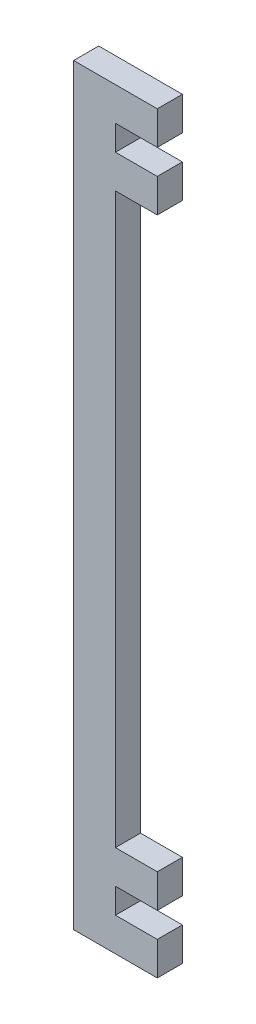
ISO-10303-21;
HEADER;
FILE_DESCRIPTION(('STEP AP214'),'2;1');
FILE_NAME('part.step','',(''),(''),'','','');
FILE_SCHEMA(('AUTOMOTIVE_DESIGN { 1 0 10303 214 1 1 1 1 }'));
ENDSEC;
DATA;
#1=APPLICATION_CONTEXT('core data for automotive mechanical design processes');
#2=APPLICATION_PROTOCOL_DEFINITION('international standard','automotive_design',2000,#1);
#3=PRODUCT_CONTEXT('',#1,'mechanical');
#4=PRODUCT('Part','Part','',(#3));
#5=PRODUCT_RELATED_PRODUCT_CATEGORY('part','',(#4));
#6=PRODUCT_DEFINITION_FORMATION('','',#4);
#7=PRODUCT_DEFINITION_CONTEXT('part definition',#1,'design');
#8=PRODUCT_DEFINITION('design','',#6,#7);
#9=PRODUCT_DEFINITION_SHAPE('','',#8);
#10=(LENGTH_UNIT() NAMED_UNIT(*) SI_UNIT(.MILLI.,.METRE.));
#11=(NAMED_UNIT(*) PLANE_ANGLE_UNIT() SI_UNIT($,.RADIAN.));
#12=(NAMED_UNIT(*) SI_UNIT($,.STERADIAN.) SOLID_ANGLE_UNIT());
#13=UNCERTAINTY_MEASURE_WITH_UNIT(LENGTH_MEASURE(1.E-05),#10,'distance_accuracy_value','');
#14=(GEOMETRIC_REPRESENTATION_CONTEXT(3) GLOBAL_UNCERTAINTY_ASSIGNED_CONTEXT((#13)) GLOBAL_UNIT_ASSIGNED_CONTEXT((#10,
#11,#12)) REPRESENTATION_CONTEXT('',''));
#15=CARTESIAN_POINT('',(0.,0.,0.));
#16=DIRECTION('',(0.,0.,1.));
#17=DIRECTION('',(1.,0.,0.));
#18=AXIS2_PLACEMENT_3D('',#15,#16,#17);
#19=CARTESIAN_POINT('',(0.,0.,3.));
#20=DIRECTION('',(1.,0.,0.));
#21=DIRECTION('',(0.,0.,-1.));
#22=AXIS2_PLACEMENT_3D('',#19,#20,#21);
#23=PLANE('',#22);
#24=DIRECTION('',(0.,-1.,0.));
#25=VECTOR('',#24,1.);
#26=CARTESIAN_POINT('',(0.,0.,0.));
#27=LINE('',#26,#25);
#28=CARTESIAN_POINT('',(0.,90.,0.));
#29=VERTEX_POINT('',#28);
#30=CARTESIAN_POINT('',(0.,0.,0.));
#31=VERTEX_POINT('',#30);
#32=EDGE_CURVE('E300',#29,#31,#27,.T.);
#33=ORIENTED_EDGE('',*,*,#32,.T.);
#34=DIRECTION('',(0.,0.,-1.));
#35=VECTOR('',#34,1.);
#36=CARTESIAN_POINT('',(0.,0.,3.));
#37=LINE('',#36,#35);
#38=CARTESIAN_POINT('',(0.,0.,3.));
#39=VERTEX_POINT('',#38);
#40=EDGE_CURVE('E12',#39,#31,#37,.T.);
#41=ORIENTED_EDGE('',*,*,#40,.F.);
#42=DIRECTION('',(0.,-1.,0.));
#43=VECTOR('',#42,1.);
#44=CARTESIAN_POINT('',(0.,0.,3.));
#45=LINE('',#44,#43);
#46=CARTESIAN_POINT('',(0.,90.,3.));
#47=VERTEX_POINT('',#46);
#48=EDGE_CURVE('E241',#47,#39,#45,.T.);
#49=ORIENTED_EDGE('',*,*,#48,.F.);
#50=DIRECTION('',(0.,0.,-1.));
#51=VECTOR('',#50,1.);
#52=CARTESIAN_POINT('',(0.,90.,3.));
#53=LINE('',#52,#51);
#54=EDGE_CURVE('E178',#47,#29,#53,.T.);
#55=ORIENTED_EDGE('',*,*,#54,.T.);
#56=EDGE_LOOP('',(#33,#41,#49,#55));
#57=FACE_BOUND('',#56,.T.);
#58=ADVANCED_FACE('F35',(#57),#23,.F.);
#59=CARTESIAN_POINT('',(0.,0.,3.));
#60=DIRECTION('',(0.,1.,0.));
#61=DIRECTION('',(0.,0.,1.));
#62=AXIS2_PLACEMENT_3D('',#59,#60,#61);
#63=PLANE('',#62);
#64=DIRECTION('',(1.,0.,0.));
#65=VECTOR('',#64,1.);
#66=CARTESIAN_POINT('',(0.,0.,0.));
#67=LINE('',#66,#65);
#68=CARTESIAN_POINT('',(10.,0.,0.));
#69=VERTEX_POINT('',#68);
#70=EDGE_CURVE('E294',#31,#69,#67,.T.);
#71=ORIENTED_EDGE('',*,*,#70,.T.);
#72=DIRECTION('',(0.,0.,-1.));
#73=VECTOR('',#72,1.);
#74=CARTESIAN_POINT('',(10.,0.,3.));
#75=LINE('',#74,#73);
#76=CARTESIAN_POINT('',(10.,0.,3.));
#77=VERTEX_POINT('',#76);
#78=EDGE_CURVE('E43',#77,#69,#75,.T.);
#79=ORIENTED_EDGE('',*,*,#78,.F.);
#80=DIRECTION('',(1.,0.,0.));
#81=VECTOR('',#80,1.);
#82=CARTESIAN_POINT('',(0.,0.,3.));
#83=LINE('',#82,#81);
#84=EDGE_CURVE('E118',#39,#77,#83,.T.);
#85=ORIENTED_EDGE('',*,*,#84,.F.);
#86=ORIENTED_EDGE('',*,*,#40,.T.);
#87=EDGE_LOOP('',(#71,#79,#85,#86));
#88=FACE_BOUND('',#87,.T.);
#89=ADVANCED_FACE('F337',(#88),#63,.F.);
#90=CARTESIAN_POINT('',(10.,0.,3.));
#91=DIRECTION('',(-1.,0.,0.));
#92=DIRECTION('',(0.,0.,1.));
#93=AXIS2_PLACEMENT_3D('',#90,#91,#92);
#94=PLANE('',#93);
#95=DIRECTION('',(0.,1.,0.));
#96=VECTOR('',#95,1.);
#97=CARTESIAN_POINT('',(10.,0.,0.));
#98=LINE('',#97,#96);
#99=CARTESIAN_POINT('',(10.,4.,0.));
#100=VERTEX_POINT('',#99);
#101=EDGE_CURVE('E289',#69,#100,#98,.T.);
#102=ORIENTED_EDGE('',*,*,#101,.T.);
#103=DIRECTION('',(0.,0.,-1.));
#104=VECTOR('',#103,1.);
#105=CARTESIAN_POINT('',(10.,4.,3.));
#106=LINE('',#105,#104);
#107=CARTESIAN_POINT('',(10.,4.,3.));
#108=VERTEX_POINT('',#107);
#109=EDGE_CURVE('E281',#108,#100,#106,.T.);
#110=ORIENTED_EDGE('',*,*,#109,.F.);
#111=DIRECTION('',(0.,1.,0.));
#112=VECTOR('',#111,1.);
#113=CARTESIAN_POINT('',(10.,0.,3.));
#114=LINE('',#113,#112);
#115=EDGE_CURVE('E233',#77,#108,#114,.T.);
#116=ORIENTED_EDGE('',*,*,#115,.F.);
#117=ORIENTED_EDGE('',*,*,#78,.T.);
#118=EDGE_LOOP('',(#102,#110,#116,#117));
#119=FACE_BOUND('',#118,.T.);
#120=ADVANCED_FACE('F287',(#119),#94,.F.);
#121=CARTESIAN_POINT('',(10.,4.,3.));
#122=DIRECTION('',(0.,-1.,0.));
#123=DIRECTION('',(1.,0.,0.));
#124=AXIS2_PLACEMENT_3D('',#121,#122,#123);
#125=PLANE('',#124);
#126=DIRECTION('',(-1.,0.,0.));
#127=VECTOR('',#126,1.);
#128=CARTESIAN_POINT('',(10.,4.,0.));
#129=LINE('',#128,#127);
#130=CARTESIAN_POINT('',(5.,4.,0.));
#131=VERTEX_POINT('',#130);
#132=EDGE_CURVE('E296',#100,#131,#129,.T.);
#133=ORIENTED_EDGE('',*,*,#132,.T.);
#134=DIRECTION('',(0.,0.,-1.));
#135=VECTOR('',#134,1.);
#136=CARTESIAN_POINT('',(5.,4.,3.));
#137=LINE('',#136,#135);
#138=CARTESIAN_POINT('',(5.,4.,3.));
#139=VERTEX_POINT('',#138);
#140=EDGE_CURVE('E278',#139,#131,#137,.T.);
#141=ORIENTED_EDGE('',*,*,#140,.F.);
#142=DIRECTION('',(-1.,0.,0.));
#143=VECTOR('',#142,1.);
#144=CARTESIAN_POINT('',(10.,4.,3.));
#145=LINE('',#144,#143);
#146=EDGE_CURVE('E229',#108,#139,#145,.T.);
#147=ORIENTED_EDGE('',*,*,#146,.F.);
#148=ORIENTED_EDGE('',*,*,#109,.T.);
#149=EDGE_LOOP('',(#133,#141,#147,#148));
#150=FACE_BOUND('',#149,.T.);
#151=ADVANCED_FACE('F344',(#150),#125,.F.);
#152=CARTESIAN_POINT('',(5.,4.,3.));
#153=DIRECTION('',(-1.,0.,0.));
#154=DIRECTION('',(0.,0.,1.));
#155=AXIS2_PLACEMENT_3D('',#152,#153,#154);
#156=PLANE('',#155);
#157=DIRECTION('',(0.,1.,0.));
#158=VECTOR('',#157,1.);
#159=CARTESIAN_POINT('',(5.,4.,0.));
#160=LINE('',#159,#158);
#161=CARTESIAN_POINT('',(5.,7.,0.));
#162=VERTEX_POINT('',#161);
#163=EDGE_CURVE('E298',#131,#162,#160,.T.);
#164=ORIENTED_EDGE('',*,*,#163,.T.);
#165=DIRECTION('',(0.,0.,-1.));
#166=VECTOR('',#165,1.);
#167=CARTESIAN_POINT('',(5.,7.,3.));
#168=LINE('',#167,#166);
#169=CARTESIAN_POINT('',(5.,7.,3.));
#170=VERTEX_POINT('',#169);
#171=EDGE_CURVE('E275',#170,#162,#168,.T.);
#172=ORIENTED_EDGE('',*,*,#171,.F.);
#173=DIRECTION('',(0.,1.,0.));
#174=VECTOR('',#173,1.);
#175=CARTESIAN_POINT('',(5.,4.,3.));
#176=LINE('',#175,#174);
#177=EDGE_CURVE('E226',#139,#170,#176,.T.);
#178=ORIENTED_EDGE('',*,*,#177,.F.);
#179=ORIENTED_EDGE('',*,*,#140,.T.);
#180=EDGE_LOOP('',(#164,#172,#178,#179));
#181=FACE_BOUND('',#180,.T.);
#182=ADVANCED_FACE('F349',(#181),#156,.F.);
#183=CARTESIAN_POINT('',(5.,7.,3.));
#184=DIRECTION('',(0.,1.,0.));
#185=DIRECTION('',(0.,0.,1.));
#186=AXIS2_PLACEMENT_3D('',#183,#184,#185);
#187=PLANE('',#186);
#188=DIRECTION('',(1.,0.,0.));
#189=VECTOR('',#188,1.);
#190=CARTESIAN_POINT('',(5.,7.,0.));
#191=LINE('',#190,#189);
#192=CARTESIAN_POINT('',(10.,7.,0.));
#193=VERTEX_POINT('',#192);
#194=EDGE_CURVE('E304',#162,#193,#191,.T.);
#195=ORIENTED_EDGE('',*,*,#194,.T.);
#196=DIRECTION('',(0.,0.,-1.));
#197=VECTOR('',#196,1.);
#198=CARTESIAN_POINT('',(10.,7.,3.));
#199=LINE('',#198,#197);
#200=CARTESIAN_POINT('',(10.,7.,3.));
#201=VERTEX_POINT('',#200);
#202=EDGE_CURVE('E272',#201,#193,#199,.T.);
#203=ORIENTED_EDGE('',*,*,#202,.F.);
#204=DIRECTION('',(1.,0.,0.));
#205=VECTOR('',#204,1.);
#206=CARTESIAN_POINT('',(5.,7.,3.));
#207=LINE('',#206,#205);
#208=EDGE_CURVE('E218',#170,#201,#207,.T.);
#209=ORIENTED_EDGE('',*,*,#208,.F.);
#210=ORIENTED_EDGE('',*,*,#171,.T.);
#211=EDGE_LOOP('',(#195,#203,#209,#210));
#212=FACE_BOUND('',#211,.T.);
#213=ADVANCED_FACE('F353',(#212),#187,.F.);
#214=CARTESIAN_POINT('',(10.,7.,3.));
#215=DIRECTION('',(-1.,0.,0.));
#216=DIRECTION('',(0.,0.,1.));
#217=AXIS2_PLACEMENT_3D('',#214,#215,#216);
#218=PLANE('',#217);
#219=DIRECTION('',(0.,1.,0.));
#220=VECTOR('',#219,1.);
#221=CARTESIAN_POINT('',(10.,7.,0.));
#222=LINE('',#221,#220);
#223=CARTESIAN_POINT('',(10.,11.,0.));
#224=VERTEX_POINT('',#223);
#225=EDGE_CURVE('E306',#193,#224,#222,.T.);
#226=ORIENTED_EDGE('',*,*,#225,.T.);
#227=DIRECTION('',(0.,0.,-1.));
#228=VECTOR('',#227,1.);
#229=CARTESIAN_POINT('',(10.,11.,3.));
#230=LINE('',#229,#228);
#231=CARTESIAN_POINT('',(10.,11.,3.));
#232=VERTEX_POINT('',#231);
#233=EDGE_CURVE('E269',#232,#224,#230,.T.);
#234=ORIENTED_EDGE('',*,*,#233,.F.);
#235=DIRECTION('',(0.,1.,0.));
#236=VECTOR('',#235,1.);
#237=CARTESIAN_POINT('',(10.,7.,3.));
#238=LINE('',#237,#236);
#239=EDGE_CURVE('E214',#201,#232,#238,.T.);
#240=ORIENTED_EDGE('',*,*,#239,.F.);
#241=ORIENTED_EDGE('',*,*,#202,.T.);
#242=EDGE_LOOP('',(#226,#234,#240,#241));
#243=FACE_BOUND('',#242,.T.);
#244=ADVANCED_FACE('F357',(#243),#218,.F.);
#245=CARTESIAN_POINT('',(10.,11.,3.));
#246=DIRECTION('',(0.,-1.,0.));
#247=DIRECTION('',(0.,0.,-1.));
#248=AXIS2_PLACEMENT_3D('',#245,#246,#247);
#249=PLANE('',#248);
#250=DIRECTION('',(-1.,0.,0.));
#251=VECTOR('',#250,1.);
#252=CARTESIAN_POINT('',(10.,11.,0.));
#253=LINE('',#252,#251);
#254=CARTESIAN_POINT('',(5.,11.,0.));
#255=VERTEX_POINT('',#254);
#256=EDGE_CURVE('E308',#224,#255,#253,.T.);
#257=ORIENTED_EDGE('',*,*,#256,.T.);
#258=DIRECTION('',(0.,0.,-1.));
#259=VECTOR('',#258,1.);
#260=CARTESIAN_POINT('',(5.,11.,3.));
#261=LINE('',#260,#259);
#262=CARTESIAN_POINT('',(5.,11.,3.));
#263=VERTEX_POINT('',#262);
#264=EDGE_CURVE('E266',#263,#255,#261,.T.);
#265=ORIENTED_EDGE('',*,*,#264,.F.);
#266=DIRECTION('',(-1.,0.,0.));
#267=VECTOR('',#266,1.);
#268=CARTESIAN_POINT('',(10.,11.,3.));
#269=LINE('',#268,#267);
#270=EDGE_CURVE('E210',#232,#263,#269,.T.);
#271=ORIENTED_EDGE('',*,*,#270,.F.);
#272=ORIENTED_EDGE('',*,*,#233,.T.);
#273=EDGE_LOOP('',(#257,#265,#271,#272));
#274=FACE_BOUND('',#273,.T.);
#275=ADVANCED_FACE('F361',(#274),#249,.F.);
#276=CARTESIAN_POINT('',(5.,11.,3.));
#277=DIRECTION('',(-1.,0.,0.));
#278=DIRECTION('',(0.,0.,1.));
#279=AXIS2_PLACEMENT_3D('',#276,#277,#278);
#280=PLANE('',#279);
#281=DIRECTION('',(0.,1.,0.));
#282=VECTOR('',#281,1.);
#283=CARTESIAN_POINT('',(5.,11.,0.));
#284=LINE('',#283,#282);
#285=CARTESIAN_POINT('',(5.,79.,0.));
#286=VERTEX_POINT('',#285);
#287=EDGE_CURVE('E310',#255,#286,#284,.T.);
#288=ORIENTED_EDGE('',*,*,#287,.T.);
#289=DIRECTION('',(0.,0.,-1.));
#290=VECTOR('',#289,1.);
#291=CARTESIAN_POINT('',(5.,79.,3.));
#292=LINE('',#291,#290);
#293=CARTESIAN_POINT('',(5.,79.,3.));
#294=VERTEX_POINT('',#293);
#295=EDGE_CURVE('E263',#294,#286,#292,.T.);
#296=ORIENTED_EDGE('',*,*,#295,.F.);
#297=DIRECTION('',(0.,1.,0.));
#298=VECTOR('',#297,1.);
#299=CARTESIAN_POINT('',(5.,11.,3.));
#300=LINE('',#299,#298);
#301=EDGE_CURVE('E207',#263,#294,#300,.T.);
#302=ORIENTED_EDGE('',*,*,#301,.F.);
#303=ORIENTED_EDGE('',*,*,#264,.T.);
#304=EDGE_LOOP('',(#288,#296,#302,#303));
#305=FACE_BOUND('',#304,.T.);
#306=ADVANCED_FACE('F365',(#305),#280,.F.);
#307=CARTESIAN_POINT('',(10.,79.,3.));
#308=DIRECTION('',(0.,1.,0.));
#309=DIRECTION('',(0.,0.,1.));
#310=AXIS2_PLACEMENT_3D('',#307,#308,#309);
#311=PLANE('',#310);
#312=DIRECTION('',(1.,0.,0.));
#313=VECTOR('',#312,1.);
#314=CARTESIAN_POINT('',(10.,79.,0.));
#315=LINE('',#314,#313);
#316=CARTESIAN_POINT('',(10.,79.,0.));
#317=VERTEX_POINT('',#316);
#318=EDGE_CURVE('E312',#286,#317,#315,.T.);
#319=ORIENTED_EDGE('',*,*,#318,.T.);
#320=DIRECTION('',(0.,0.,-1.));
#321=VECTOR('',#320,1.);
#322=CARTESIAN_POINT('',(10.,79.,3.));
#323=LINE('',#322,#321);
#324=CARTESIAN_POINT('',(10.,79.,3.));
#325=VERTEX_POINT('',#324);
#326=EDGE_CURVE('E260',#325,#317,#323,.T.);
#327=ORIENTED_EDGE('',*,*,#326,.F.);
#328=DIRECTION('',(1.,0.,0.));
#329=VECTOR('',#328,1.);
#330=CARTESIAN_POINT('',(10.,79.,3.));
#331=LINE('',#330,#329);
#332=EDGE_CURVE('E199',#294,#325,#331,.T.);
#333=ORIENTED_EDGE('',*,*,#332,.F.);
#334=ORIENTED_EDGE('',*,*,#295,.T.);
#335=EDGE_LOOP('',(#319,#327,#333,#334));
#336=FACE_BOUND('',#335,.T.);
#337=ADVANCED_FACE('F369',(#336),#311,.F.);
#338=CARTESIAN_POINT('',(10.,83.,3.));
#339=DIRECTION('',(-1.,0.,0.));
#340=DIRECTION('',(0.,0.,1.));
#341=AXIS2_PLACEMENT_3D('',#338,#339,#340);
#342=PLANE('',#341);
#343=DIRECTION('',(0.,1.,0.));
#344=VECTOR('',#343,1.);
#345=CARTESIAN_POINT('',(10.,83.,0.));
#346=LINE('',#345,#344);
#347=CARTESIAN_POINT('',(10.,83.,0.));
#348=VERTEX_POINT('',#347);
#349=EDGE_CURVE('E314',#317,#348,#346,.T.);
#350=ORIENTED_EDGE('',*,*,#349,.T.);
#351=DIRECTION('',(0.,0.,-1.));
#352=VECTOR('',#351,1.);
#353=CARTESIAN_POINT('',(10.,83.,3.));
#354=LINE('',#353,#352);
#355=CARTESIAN_POINT('',(10.,83.,3.));
#356=VERTEX_POINT('',#355);
#357=EDGE_CURVE('E257',#356,#348,#354,.T.);
#358=ORIENTED_EDGE('',*,*,#357,.F.);
#359=DIRECTION('',(0.,1.,0.));
#360=VECTOR('',#359,1.);
#361=CARTESIAN_POINT('',(10.,83.,3.));
#362=LINE('',#361,#360);
#363=EDGE_CURVE('E195',#325,#356,#362,.T.);
#364=ORIENTED_EDGE('',*,*,#363,.F.);
#365=ORIENTED_EDGE('',*,*,#326,.T.);
#366=EDGE_LOOP('',(#350,#358,#364,#365));
#367=FACE_BOUND('',#366,.T.);
#368=ADVANCED_FACE('F373',(#367),#342,.F.);
#369=CARTESIAN_POINT('',(5.,83.,3.));
#370=DIRECTION('',(0.,-1.,0.));
#371=DIRECTION('',(0.,0.,-1.));
#372=AXIS2_PLACEMENT_3D('',#369,#370,#371);
#373=PLANE('',#372);
#374=DIRECTION('',(-1.,0.,0.));
#375=VECTOR('',#374,1.);
#376=CARTESIAN_POINT('',(5.,83.,0.));
#377=LINE('',#376,#375);
#378=CARTESIAN_POINT('',(5.,83.,0.));
#379=VERTEX_POINT('',#378);
#380=EDGE_CURVE('E316',#348,#379,#377,.T.);
#381=ORIENTED_EDGE('',*,*,#380,.T.);
#382=DIRECTION('',(0.,0.,-1.));
#383=VECTOR('',#382,1.);
#384=CARTESIAN_POINT('',(5.,83.,3.));
#385=LINE('',#384,#383);
#386=CARTESIAN_POINT('',(5.,83.,3.));
#387=VERTEX_POINT('',#386);
#388=EDGE_CURVE('E254',#387,#379,#385,.T.);
#389=ORIENTED_EDGE('',*,*,#388,.F.);
#390=DIRECTION('',(-1.,0.,0.));
#391=VECTOR('',#390,1.);
#392=CARTESIAN_POINT('',(5.,83.,3.));
#393=LINE('',#392,#391);
#394=EDGE_CURVE('E191',#356,#387,#393,.T.);
#395=ORIENTED_EDGE('',*,*,#394,.F.);
#396=ORIENTED_EDGE('',*,*,#357,.T.);
#397=EDGE_LOOP('',(#381,#389,#395,#396));
#398=FACE_BOUND('',#397,.T.);
#399=ADVANCED_FACE('F377',(#398),#373,.F.);
#400=CARTESIAN_POINT('',(5.,86.,3.));
#401=DIRECTION('',(-1.,0.,0.));
#402=DIRECTION('',(0.,0.,1.));
#403=AXIS2_PLACEMENT_3D('',#400,#401,#402);
#404=PLANE('',#403);
#405=DIRECTION('',(0.,1.,0.));
#406=VECTOR('',#405,1.);
#407=CARTESIAN_POINT('',(5.,86.,0.));
#408=LINE('',#407,#406);
#409=CARTESIAN_POINT('',(5.,86.,0.));
#410=VERTEX_POINT('',#409);
#411=EDGE_CURVE('E318',#379,#410,#408,.T.);
#412=ORIENTED_EDGE('',*,*,#411,.T.);
#413=DIRECTION('',(0.,0.,-1.));
#414=VECTOR('',#413,1.);
#415=CARTESIAN_POINT('',(5.,86.,3.));
#416=LINE('',#415,#414);
#417=CARTESIAN_POINT('',(5.,86.,3.));
#418=VERTEX_POINT('',#417);
#419=EDGE_CURVE('E171',#418,#410,#416,.T.);
#420=ORIENTED_EDGE('',*,*,#419,.F.);
#421=DIRECTION('',(0.,1.,0.));
#422=VECTOR('',#421,1.);
#423=CARTESIAN_POINT('',(5.,86.,3.));
#424=LINE('',#423,#422);
#425=EDGE_CURVE('E161',#387,#418,#424,.T.);
#426=ORIENTED_EDGE('',*,*,#425,.F.);
#427=ORIENTED_EDGE('',*,*,#388,.T.);
#428=EDGE_LOOP('',(#412,#420,#426,#427));
#429=FACE_BOUND('',#428,.T.);
#430=ADVANCED_FACE('F321',(#429),#404,.F.);
#431=CARTESIAN_POINT('',(10.,86.,3.));
#432=DIRECTION('',(0.,1.,0.));
#433=DIRECTION('',(-1.,0.,0.));
#434=AXIS2_PLACEMENT_3D('',#431,#432,#433);
#435=PLANE('',#434);
#436=DIRECTION('',(1.,0.,0.));
#437=VECTOR('',#436,1.);
#438=CARTESIAN_POINT('',(10.,86.,0.));
#439=LINE('',#438,#437);
#440=CARTESIAN_POINT('',(10.,86.,0.));
#441=VERTEX_POINT('',#440);
#442=EDGE_CURVE('E170',#410,#441,#439,.T.);
#443=ORIENTED_EDGE('',*,*,#442,.T.);
#444=DIRECTION('',(0.,0.,-1.));
#445=VECTOR('',#444,1.);
#446=CARTESIAN_POINT('',(10.,86.,3.));
#447=LINE('',#446,#445);
#448=CARTESIAN_POINT('',(10.,86.,3.));
#449=VERTEX_POINT('',#448);
#450=EDGE_CURVE('E167',#449,#441,#447,.T.);
#451=ORIENTED_EDGE('',*,*,#450,.F.);
#452=DIRECTION('',(1.,0.,0.));
#453=VECTOR('',#452,1.);
#454=CARTESIAN_POINT('',(10.,86.,3.));
#455=LINE('',#454,#453);
#456=EDGE_CURVE('E155',#418,#449,#455,.T.);
#457=ORIENTED_EDGE('',*,*,#456,.F.);
#458=ORIENTED_EDGE('',*,*,#419,.T.);
#459=EDGE_LOOP('',(#443,#451,#457,#458));
#460=FACE_BOUND('',#459,.T.);
#461=ADVANCED_FACE('F168',(#460),#435,.F.);
#462=CARTESIAN_POINT('',(10.,90.,3.));
#463=DIRECTION('',(-1.,0.,0.));
#464=DIRECTION('',(0.,0.,1.));
#465=AXIS2_PLACEMENT_3D('',#462,#463,#464);
#466=PLANE('',#465);
#467=DIRECTION('',(0.,1.,0.));
#468=VECTOR('',#467,1.);
#469=CARTESIAN_POINT('',(10.,90.,0.));
#470=LINE('',#469,#468);
#471=CARTESIAN_POINT('',(10.,90.,0.));
#472=VERTEX_POINT('',#471);
#473=EDGE_CURVE('E104',#441,#472,#470,.T.);
#474=ORIENTED_EDGE('',*,*,#473,.T.);
#475=DIRECTION('',(0.,0.,-1.));
#476=VECTOR('',#475,1.);
#477=CARTESIAN_POINT('',(10.,90.,3.));
#478=LINE('',#477,#476);
#479=CARTESIAN_POINT('',(10.,90.,3.));
#480=VERTEX_POINT('',#479);
#481=EDGE_CURVE('E172',#480,#472,#478,.T.);
#482=ORIENTED_EDGE('',*,*,#481,.F.);
#483=DIRECTION('',(0.,1.,0.));
#484=VECTOR('',#483,1.);
#485=CARTESIAN_POINT('',(10.,90.,3.));
#486=LINE('',#485,#484);
#487=EDGE_CURVE('E159',#449,#480,#486,.T.);
#488=ORIENTED_EDGE('',*,*,#487,.F.);
#489=ORIENTED_EDGE('',*,*,#450,.T.);
#490=EDGE_LOOP('',(#474,#482,#488,#489));
#491=FACE_BOUND('',#490,.T.);
#492=ADVANCED_FACE('F174',(#491),#466,.F.);
#493=CARTESIAN_POINT('',(0.,90.,3.));
#494=DIRECTION('',(0.,-1.,0.));
#495=DIRECTION('',(0.,0.,-1.));
#496=AXIS2_PLACEMENT_3D('',#493,#494,#495);
#497=PLANE('',#496);
#498=DIRECTION('',(-1.,0.,0.));
#499=VECTOR('',#498,1.);
#500=CARTESIAN_POINT('',(0.,90.,0.));
#501=LINE('',#500,#499);
#502=EDGE_CURVE('E110',#472,#29,#501,.T.);
#503=ORIENTED_EDGE('',*,*,#502,.T.);
#504=ORIENTED_EDGE('',*,*,#54,.F.);
#505=DIRECTION('',(-1.,0.,0.));
#506=VECTOR('',#505,1.);
#507=CARTESIAN_POINT('',(0.,90.,3.));
#508=LINE('',#507,#506);
#509=EDGE_CURVE('E51',#480,#47,#508,.T.);
#510=ORIENTED_EDGE('',*,*,#509,.F.);
#511=ORIENTED_EDGE('',*,*,#481,.T.);
#512=EDGE_LOOP('',(#503,#504,#510,#511));
#513=FACE_BOUND('',#512,.T.);
#514=ADVANCED_FACE('F326',(#513),#497,.F.);
#515=CARTESIAN_POINT('',(0.,0.,3.));
#516=DIRECTION('',(0.,0.,-1.));
#517=DIRECTION('',(-1.,0.,0.));
#518=AXIS2_PLACEMENT_3D('',#515,#516,#517);
#519=PLANE('',#518);
#520=ORIENTED_EDGE('',*,*,#48,.T.);
#521=ORIENTED_EDGE('',*,*,#84,.T.);
#522=ORIENTED_EDGE('',*,*,#115,.T.);
#523=ORIENTED_EDGE('',*,*,#146,.T.);
#524=ORIENTED_EDGE('',*,*,#177,.T.);
#525=ORIENTED_EDGE('',*,*,#208,.T.);
#526=ORIENTED_EDGE('',*,*,#239,.T.);
#527=ORIENTED_EDGE('',*,*,#270,.T.);
#528=ORIENTED_EDGE('',*,*,#301,.T.);
#529=ORIENTED_EDGE('',*,*,#332,.T.);
#530=ORIENTED_EDGE('',*,*,#363,.T.);
#531=ORIENTED_EDGE('',*,*,#394,.T.);
#532=ORIENTED_EDGE('',*,*,#425,.T.);
#533=ORIENTED_EDGE('',*,*,#456,.T.);
#534=ORIENTED_EDGE('',*,*,#487,.T.);
#535=ORIENTED_EDGE('',*,*,#509,.T.);
#536=EDGE_LOOP('',(#520,#521,#522,#523,#524,#525,#526,#527,#528,#529,#530,#531,#532,#533,#534,#535));
#537=FACE_BOUND('',#536,.T.);
#538=ADVANCED_FACE('F157',(#537),#519,.F.);
#539=CARTESIAN_POINT('',(0.,0.,0.));
#540=DIRECTION('',(0.,0.,-1.));
#541=DIRECTION('',(-1.,0.,0.));
#542=AXIS2_PLACEMENT_3D('',#539,#540,#541);
#543=PLANE('',#542);
#544=ORIENTED_EDGE('',*,*,#32,.F.);
#545=ORIENTED_EDGE('',*,*,#502,.F.);
#546=ORIENTED_EDGE('',*,*,#473,.F.);
#547=ORIENTED_EDGE('',*,*,#442,.F.);
#548=ORIENTED_EDGE('',*,*,#411,.F.);
#549=ORIENTED_EDGE('',*,*,#380,.F.);
#550=ORIENTED_EDGE('',*,*,#349,.F.);
#551=ORIENTED_EDGE('',*,*,#318,.F.);
#552=ORIENTED_EDGE('',*,*,#287,.F.);
#553=ORIENTED_EDGE('',*,*,#256,.F.);
#554=ORIENTED_EDGE('',*,*,#225,.F.);
#555=ORIENTED_EDGE('',*,*,#194,.F.);
#556=ORIENTED_EDGE('',*,*,#163,.F.);
#557=ORIENTED_EDGE('',*,*,#132,.F.);
#558=ORIENTED_EDGE('',*,*,#101,.F.);
#559=ORIENTED_EDGE('',*,*,#70,.F.);
#560=EDGE_LOOP('',(#544,#545,#546,#547,#548,#549,#550,#551,#552,#553,#554,#555,#556,#557,#558,#559));
#561=FACE_BOUND('',#560,.T.);
#562=ADVANCED_FACE('F293',(#561),#543,.T.);
#563=CLOSED_SHELL('',(#58,#89,#120,#151,#182,#213,#244,#275,#306,#337,#368,#399,#430,#461,#492,
#514,#538,#562));
#564=MANIFOLD_SOLID_BREP('B2',#563);
#565=ADVANCED_BREP_SHAPE_REPRESENTATION('',(#18,#564),#14);
#566=SHAPE_DEFINITION_REPRESENTATION(#9,#565);
ENDSEC;
END-ISO-10303-21;
